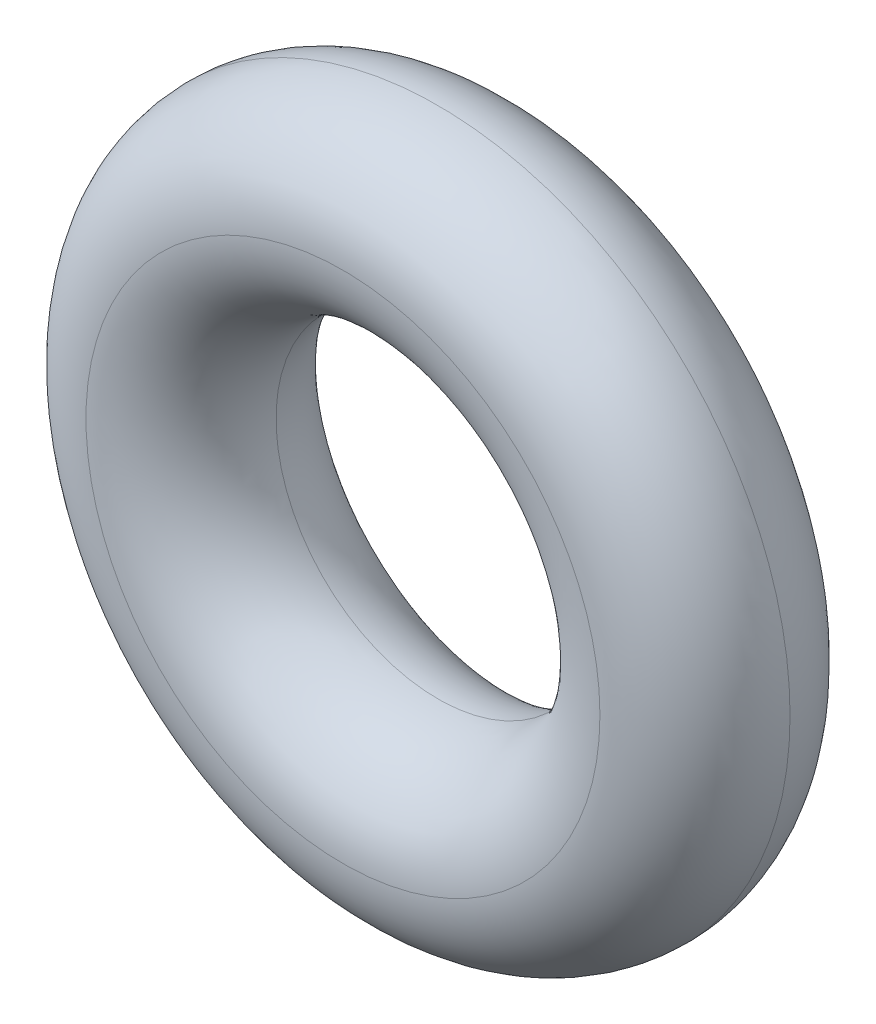
ISO-10303-21;
HEADER;
FILE_DESCRIPTION(('STEP AP214'),'2;1');
FILE_NAME('part.step','',(''),(''),'','','');
FILE_SCHEMA(('AUTOMOTIVE_DESIGN { 1 0 10303 214 1 1 1 1 }'));
ENDSEC;
DATA;
#1=APPLICATION_CONTEXT('core data for automotive mechanical design processes');
#2=APPLICATION_PROTOCOL_DEFINITION('international standard','automotive_design',2000,#1);
#3=PRODUCT_CONTEXT('',#1,'mechanical');
#4=PRODUCT('Part','Part','',(#3));
#5=PRODUCT_RELATED_PRODUCT_CATEGORY('part','',(#4));
#6=PRODUCT_DEFINITION_FORMATION('','',#4);
#7=PRODUCT_DEFINITION_CONTEXT('part definition',#1,'design');
#8=PRODUCT_DEFINITION('design','',#6,#7);
#9=PRODUCT_DEFINITION_SHAPE('','',#8);
#10=(LENGTH_UNIT() NAMED_UNIT(*) SI_UNIT(.MILLI.,.METRE.));
#11=(NAMED_UNIT(*) PLANE_ANGLE_UNIT() SI_UNIT($,.RADIAN.));
#12=(NAMED_UNIT(*) SI_UNIT($,.STERADIAN.) SOLID_ANGLE_UNIT());
#13=UNCERTAINTY_MEASURE_WITH_UNIT(LENGTH_MEASURE(1.E-05),#10,'distance_accuracy_value','');
#14=(GEOMETRIC_REPRESENTATION_CONTEXT(3) GLOBAL_UNCERTAINTY_ASSIGNED_CONTEXT((#13)) GLOBAL_UNIT_ASSIGNED_CONTEXT((#10,
#11,#12)) REPRESENTATION_CONTEXT('',''));
#15=CARTESIAN_POINT('',(0.,0.,0.));
#16=DIRECTION('',(0.,0.,1.));
#17=DIRECTION('',(1.,0.,0.));
#18=AXIS2_PLACEMENT_3D('',#15,#16,#17);
#19=CARTESIAN_POINT('',(0.,0.,67.5));
#20=DIRECTION('',(0.,0.,1.));
#21=DIRECTION('',(1.,0.,0.));
#22=AXIS2_PLACEMENT_3D('',#19,#20,#21);
#23=TOROIDAL_SURFACE('',#22,182.5,67.5);
#24=CARTESIAN_POINT('',(0.,0.,67.5));
#25=DIRECTION('',(0.,0.,1.));
#26=DIRECTION('',(1.,0.,0.));
#27=AXIS2_PLACEMENT_3D('',#24,#25,#26);
#28=CIRCLE('',#27,250.);
#29=CARTESIAN_POINT('',(250.,0.,67.5));
#30=VERTEX_POINT('',#29);
#31=EDGE_CURVE('E41',#30,#30,#28,.F.);
#32=ORIENTED_EDGE('',*,*,#31,.F.);
#33=EDGE_LOOP('',(#32));
#34=FACE_BOUND('',#33,.T.);
#35=CARTESIAN_POINT('',(0.,0.,135.));
#36=DIRECTION('',(0.,0.,1.));
#37=DIRECTION('',(1.,0.,0.));
#38=AXIS2_PLACEMENT_3D('',#35,#36,#37);
#39=CIRCLE('',#38,182.5);
#40=CARTESIAN_POINT('',(182.5,0.,135.));
#41=VERTEX_POINT('',#40);
#42=EDGE_CURVE('E10',#41,#41,#39,.T.);
#43=ORIENTED_EDGE('',*,*,#42,.F.);
#44=EDGE_LOOP('',(#43));
#45=FACE_BOUND('',#44,.T.);
#46=ADVANCED_FACE('F35',(#34,#45),#23,.T.);
#47=CARTESIAN_POINT('',(0.,0.,67.5));
#48=DIRECTION('',(0.,0.,1.));
#49=DIRECTION('',(1.,0.,0.));
#50=AXIS2_PLACEMENT_3D('',#47,#48,#49);
#51=TOROIDAL_SURFACE('',#50,182.5,67.5);
#52=ORIENTED_EDGE('',*,*,#42,.T.);
#53=EDGE_LOOP('',(#52));
#54=FACE_BOUND('',#53,.T.);
#55=CARTESIAN_POINT('',(0.,0.,67.5));
#56=DIRECTION('',(0.,0.,1.));
#57=DIRECTION('',(1.,0.,0.));
#58=AXIS2_PLACEMENT_3D('',#55,#56,#57);
#59=CIRCLE('',#58,115.);
#60=CARTESIAN_POINT('',(115.,0.,67.5));
#61=VERTEX_POINT('',#60);
#62=EDGE_CURVE('E45',#61,#61,#59,.T.);
#63=ORIENTED_EDGE('',*,*,#62,.F.);
#64=EDGE_LOOP('',(#63));
#65=FACE_BOUND('',#64,.T.);
#66=ADVANCED_FACE('F59',(#54,#65),#51,.T.);
#67=CARTESIAN_POINT('',(0.,0.,67.5));
#68=DIRECTION('',(0.,0.,1.));
#69=DIRECTION('',(1.,0.,0.));
#70=AXIS2_PLACEMENT_3D('',#67,#68,#69);
#71=TOROIDAL_SURFACE('',#70,182.5,67.5);
#72=ORIENTED_EDGE('',*,*,#31,.T.);
#73=EDGE_LOOP('',(#72));
#74=FACE_BOUND('',#73,.T.);
#75=CARTESIAN_POINT('',(0.,0.,0.));
#76=DIRECTION('',(0.,0.,1.));
#77=DIRECTION('',(1.,0.,0.));
#78=AXIS2_PLACEMENT_3D('',#75,#76,#77);
#79=CIRCLE('',#78,182.5);
#80=CARTESIAN_POINT('',(182.5,0.,0.));
#81=VERTEX_POINT('',#80);
#82=EDGE_CURVE('E49',#81,#81,#79,.F.);
#83=ORIENTED_EDGE('',*,*,#82,.F.);
#84=EDGE_LOOP('',(#83));
#85=FACE_BOUND('',#84,.T.);
#86=ADVANCED_FACE('F57',(#74,#85),#71,.T.);
#87=CARTESIAN_POINT('',(0.,0.,67.5));
#88=DIRECTION('',(0.,0.,1.));
#89=DIRECTION('',(1.,0.,0.));
#90=AXIS2_PLACEMENT_3D('',#87,#88,#89);
#91=TOROIDAL_SURFACE('',#90,182.5,67.5);
#92=ORIENTED_EDGE('',*,*,#62,.T.);
#93=EDGE_LOOP('',(#92));
#94=FACE_BOUND('',#93,.T.);
#95=ORIENTED_EDGE('',*,*,#82,.T.);
#96=EDGE_LOOP('',(#95));
#97=FACE_BOUND('',#96,.T.);
#98=ADVANCED_FACE('F55',(#94,#97),#91,.T.);
#99=CLOSED_SHELL('',(#46,#66,#86,#98));
#100=MANIFOLD_SOLID_BREP('B2',#99);
#101=ADVANCED_BREP_SHAPE_REPRESENTATION('',(#18,#100),#14);
#102=SHAPE_DEFINITION_REPRESENTATION(#9,#101);
ENDSEC;
END-ISO-10303-21;
